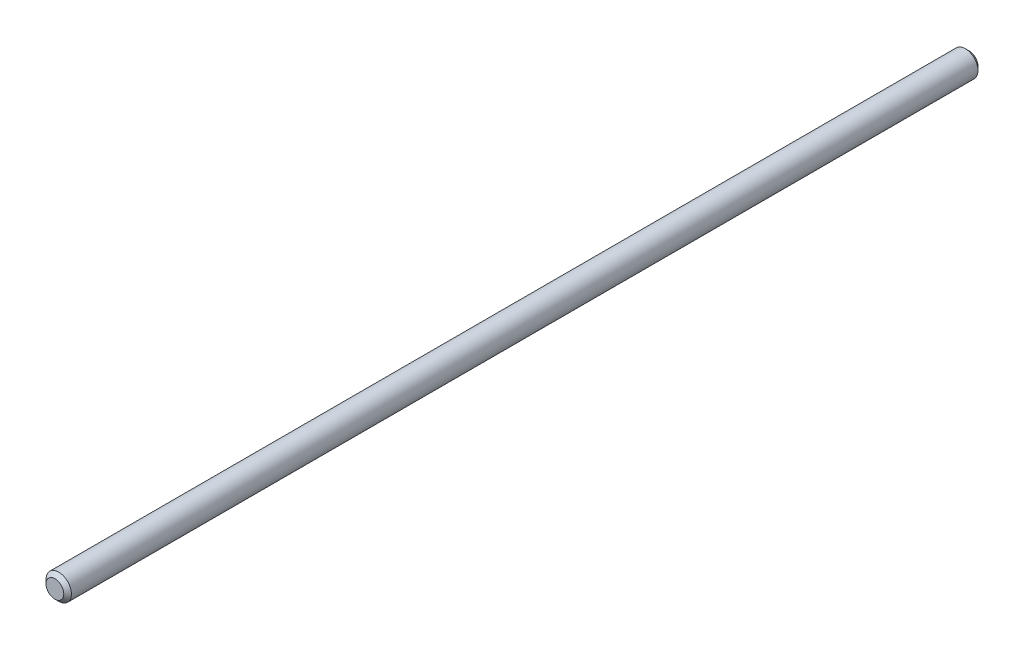
ISO-10303-21;
HEADER;
FILE_DESCRIPTION(('STEP AP214'),'2;1');
FILE_NAME('part.step','',(''),(''),'','','');
FILE_SCHEMA(('AUTOMOTIVE_DESIGN { 1 0 10303 214 1 1 1 1 }'));
ENDSEC;
DATA;
#1=APPLICATION_CONTEXT('core data for automotive mechanical design processes');
#2=APPLICATION_PROTOCOL_DEFINITION('international standard','automotive_design',2000,#1);
#3=PRODUCT_CONTEXT('',#1,'mechanical');
#4=PRODUCT('Part','Part','',(#3));
#5=PRODUCT_RELATED_PRODUCT_CATEGORY('part','',(#4));
#6=PRODUCT_DEFINITION_FORMATION('','',#4);
#7=PRODUCT_DEFINITION_CONTEXT('part definition',#1,'design');
#8=PRODUCT_DEFINITION('design','',#6,#7);
#9=PRODUCT_DEFINITION_SHAPE('','',#8);
#10=(LENGTH_UNIT() NAMED_UNIT(*) SI_UNIT(.MILLI.,.METRE.));
#11=(NAMED_UNIT(*) PLANE_ANGLE_UNIT() SI_UNIT($,.RADIAN.));
#12=(NAMED_UNIT(*) SI_UNIT($,.STERADIAN.) SOLID_ANGLE_UNIT());
#13=UNCERTAINTY_MEASURE_WITH_UNIT(LENGTH_MEASURE(1.E-05),#10,'distance_accuracy_value','');
#14=(GEOMETRIC_REPRESENTATION_CONTEXT(3) GLOBAL_UNCERTAINTY_ASSIGNED_CONTEXT((#13)) GLOBAL_UNIT_ASSIGNED_CONTEXT((#10,
#11,#12)) REPRESENTATION_CONTEXT('',''));
#15=CARTESIAN_POINT('',(0.,0.,0.));
#16=DIRECTION('',(0.,0.,1.));
#17=DIRECTION('',(1.,0.,0.));
#18=AXIS2_PLACEMENT_3D('',#15,#16,#17);
#19=CARTESIAN_POINT('',(0.,0.,180.));
#20=DIRECTION('',(0.,0.,-1.));
#21=DIRECTION('',(-1.,0.,0.));
#22=AXIS2_PLACEMENT_3D('',#19,#20,#21);
#23=CYLINDRICAL_SURFACE('',#22,2.5);
#24=CARTESIAN_POINT('',(0.,0.,0.750000000000112));
#25=DIRECTION('',(0.,0.,1.));
#26=DIRECTION('',(1.,0.,0.));
#27=AXIS2_PLACEMENT_3D('',#24,#25,#26);
#28=CIRCLE('',#27,2.5);
#29=CARTESIAN_POINT('',(-2.5,0.,0.750000000000112));
#30=VERTEX_POINT('',#29);
#31=EDGE_CURVE('E42',#30,#30,#28,.T.);
#32=CARTESIAN_POINT('',(0.,0.,179.25));
#33=DIRECTION('',(0.,0.,1.));
#34=DIRECTION('',(1.,0.,0.));
#35=AXIS2_PLACEMENT_3D('',#32,#33,#34);
#36=CIRCLE('',#35,2.5);
#37=CARTESIAN_POINT('',(-2.5,0.,179.25));
#38=VERTEX_POINT('',#37);
#39=EDGE_CURVE('E46',#38,#38,#36,.F.);
#40=CARTESIAN_POINT('',(-2.5,0.,0.750000000000112));
#41=CARTESIAN_POINT('',(-2.5,0.,2.6093750000001));
#42=CARTESIAN_POINT('',(-2.5,0.,4.4687500000001));
#43=CARTESIAN_POINT('',(-2.5,0.,8.18750000000011));
#44=CARTESIAN_POINT('',(-2.5,0.,10.0468750000001));
#45=CARTESIAN_POINT('',(-2.5,0.,13.7656250000001));
#46=CARTESIAN_POINT('',(-2.5,0.,15.6250000000001));
#47=CARTESIAN_POINT('',(-2.5,0.,19.3437500000001));
#48=CARTESIAN_POINT('',(-2.5,0.,21.2031250000001));
#49=CARTESIAN_POINT('',(-2.5,0.,24.9218750000001));
#50=CARTESIAN_POINT('',(-2.5,0.,26.7812500000001));
#51=CARTESIAN_POINT('',(-2.5,0.,30.5000000000001));
#52=CARTESIAN_POINT('',(-2.5,0.,32.3593750000001));
#53=CARTESIAN_POINT('',(-2.5,0.,36.0781250000001));
#54=CARTESIAN_POINT('',(-2.5,0.,37.9375000000001));
#55=CARTESIAN_POINT('',(-2.5,0.,41.6562500000001));
#56=CARTESIAN_POINT('',(-2.5,0.,43.5156250000001));
#57=CARTESIAN_POINT('',(-2.5,0.,47.2343750000001));
#58=CARTESIAN_POINT('',(-2.5,0.,49.0937500000001));
#59=CARTESIAN_POINT('',(-2.5,0.,52.8125000000001));
#60=CARTESIAN_POINT('',(-2.5,0.,54.6718750000001));
#61=CARTESIAN_POINT('',(-2.5,0.,58.3906250000001));
#62=CARTESIAN_POINT('',(-2.5,0.,60.2500000000001));
#63=CARTESIAN_POINT('',(-2.5,0.,63.9687500000001));
#64=CARTESIAN_POINT('',(-2.5,0.,65.8281250000001));
#65=CARTESIAN_POINT('',(-2.5,0.,69.5468750000001));
#66=CARTESIAN_POINT('',(-2.5,0.,71.4062500000001));
#67=CARTESIAN_POINT('',(-2.5,0.,75.1250000000001));
#68=CARTESIAN_POINT('',(-2.5,0.,76.9843750000001));
#69=CARTESIAN_POINT('',(-2.5,0.,80.7031250000001));
#70=CARTESIAN_POINT('',(-2.5,0.,82.5625000000001));
#71=CARTESIAN_POINT('',(-2.5,0.,86.2812500000001));
#72=CARTESIAN_POINT('',(-2.5,0.,88.1406250000001));
#73=CARTESIAN_POINT('',(-2.5,0.,91.8593750000001));
#74=CARTESIAN_POINT('',(-2.5,0.,93.7187500000001));
#75=CARTESIAN_POINT('',(-2.5,0.,97.4375000000001));
#76=CARTESIAN_POINT('',(-2.5,0.,99.2968750000001));
#77=CARTESIAN_POINT('',(-2.5,0.,103.015625));
#78=CARTESIAN_POINT('',(-2.5,0.,104.875));
#79=CARTESIAN_POINT('',(-2.5,0.,108.59375));
#80=CARTESIAN_POINT('',(-2.5,0.,110.453125));
#81=CARTESIAN_POINT('',(-2.5,0.,114.171875));
#82=CARTESIAN_POINT('',(-2.5,0.,116.03125));
#83=CARTESIAN_POINT('',(-2.5,0.,119.75));
#84=CARTESIAN_POINT('',(-2.5,0.,121.609375));
#85=CARTESIAN_POINT('',(-2.5,0.,125.328125));
#86=CARTESIAN_POINT('',(-2.5,0.,127.1875));
#87=CARTESIAN_POINT('',(-2.5,0.,130.90625));
#88=CARTESIAN_POINT('',(-2.5,0.,132.765625));
#89=CARTESIAN_POINT('',(-2.5,0.,136.484375));
#90=CARTESIAN_POINT('',(-2.5,0.,138.34375));
#91=CARTESIAN_POINT('',(-2.5,0.,142.0625));
#92=CARTESIAN_POINT('',(-2.5,0.,143.921875));
#93=CARTESIAN_POINT('',(-2.5,0.,147.640625));
#94=CARTESIAN_POINT('',(-2.5,0.,149.5));
#95=CARTESIAN_POINT('',(-2.5,0.,153.21875));
#96=CARTESIAN_POINT('',(-2.5,0.,155.078125));
#97=CARTESIAN_POINT('',(-2.5,0.,158.796875));
#98=CARTESIAN_POINT('',(-2.5,0.,160.65625));
#99=CARTESIAN_POINT('',(-2.5,0.,164.375));
#100=CARTESIAN_POINT('',(-2.5,0.,166.234375));
#101=CARTESIAN_POINT('',(-2.5,0.,169.953125));
#102=CARTESIAN_POINT('',(-2.5,0.,171.8125));
#103=CARTESIAN_POINT('',(-2.5,0.,175.53125));
#104=CARTESIAN_POINT('',(-2.5,0.,177.390625));
#105=CARTESIAN_POINT('',(-2.5,0.,179.25));
#106=B_SPLINE_CURVE_WITH_KNOTS('',3,(#40,#41,#42,#43,#44,#45,#46,#47,#48,#49,#50,#51,#52,#53,
#54,#55,#56,#57,#58,#59,#60,#61,#62,#63,#64,#65,#66,#67,#68,#69,#70,#71,#72,#73,#74,#75,#76,#77,
#78,#79,#80,#81,#82,#83,#84,#85,#86,#87,#88,#89,#90,#91,#92,#93,#94,#95,#96,#97,#98,#99,#100,
#101,#102,#103,#104,#105),.UNSPECIFIED.,.F.,.F.,(4,2,2,2,2,2,2,2,2,2,2,2,2,2,2,2,2,2,2,2,2,2,2,
2,2,2,2,2,2,2,2,2,4),(0.,5.57812499999999,11.15625,16.734375,22.3125,27.890625,33.46875,
39.046875,44.625,50.203125,55.78125,61.359375,66.9375,72.515625,78.09375,83.671875,89.25,
94.828125,100.40625,105.984375,111.5625,117.140625,122.71875,128.296875,133.875,139.453125,
145.03125,150.609375,156.1875,161.765625,167.34375,172.921875,178.5),.UNSPECIFIED.);
#107=EDGE_CURVE('BSEAM31',#30,#38,#106,.T.);
#108=ORIENTED_EDGE('',*,*,#31,.T.);
#109=ORIENTED_EDGE('',*,*,#39,.T.);
#110=ORIENTED_EDGE('',*,*,#107,.T.);
#111=ORIENTED_EDGE('',*,*,#107,.F.);
#112=EDGE_LOOP('',(#108,#110,#109,#111));
#113=FACE_BOUND('',#112,.T.);
#114=ADVANCED_FACE('F31',(#113),#23,.T.);
#115=CARTESIAN_POINT('',(0.,0.,180.));
#116=DIRECTION('',(0.,0.,1.));
#117=DIRECTION('',(1.,0.,0.));
#118=AXIS2_PLACEMENT_3D('',#115,#116,#117);
#119=PLANE('',#118);
#120=CARTESIAN_POINT('',(0.,0.,180.));
#121=DIRECTION('',(0.,0.,1.));
#122=DIRECTION('',(1.,0.,0.));
#123=AXIS2_PLACEMENT_3D('',#120,#121,#122);
#124=CIRCLE('',#123,1.75000000000011);
#125=CARTESIAN_POINT('',(1.75000000000011,0.,180.));
#126=VERTEX_POINT('',#125);
#127=EDGE_CURVE('E10',#126,#126,#124,.T.);
#128=ORIENTED_EDGE('',*,*,#127,.T.);
#129=EDGE_LOOP('',(#128));
#130=FACE_BOUND('',#129,.T.);
#131=ADVANCED_FACE('F62',(#130),#119,.T.);
#132=CARTESIAN_POINT('',(0.,0.,0.));
#133=DIRECTION('',(0.,0.,1.));
#134=DIRECTION('',(1.,0.,0.));
#135=AXIS2_PLACEMENT_3D('',#132,#133,#134);
#136=PLANE('',#135);
#137=CARTESIAN_POINT('',(0.,0.,0.));
#138=DIRECTION('',(0.,0.,1.));
#139=DIRECTION('',(1.,0.,0.));
#140=AXIS2_PLACEMENT_3D('',#137,#138,#139);
#141=CIRCLE('',#140,1.74999999999989);
#142=CARTESIAN_POINT('',(1.74999999999989,0.,0.));
#143=VERTEX_POINT('',#142);
#144=EDGE_CURVE('E38',#143,#143,#141,.F.);
#145=ORIENTED_EDGE('',*,*,#144,.T.);
#146=EDGE_LOOP('',(#145));
#147=FACE_BOUND('',#146,.T.);
#148=ADVANCED_FACE('F59',(#147),#136,.F.);
#149=CARTESIAN_POINT('',(0.,0.,0.750000000000112));
#150=DIRECTION('',(0.,0.,1.));
#151=DIRECTION('',(1.,0.,0.));
#152=AXIS2_PLACEMENT_3D('',#149,#150,#151);
#153=CONICAL_SURFACE('',#152,2.5,0.785398163397447);
#154=ORIENTED_EDGE('',*,*,#144,.F.);
#155=EDGE_LOOP('',(#154));
#156=FACE_BOUND('',#155,.T.);
#157=ORIENTED_EDGE('',*,*,#31,.F.);
#158=EDGE_LOOP('',(#157));
#159=FACE_BOUND('',#158,.T.);
#160=ADVANCED_FACE('F55',(#156,#159),#153,.T.);
#161=CARTESIAN_POINT('',(0.,0.,180.));
#162=DIRECTION('',(0.,0.,-1.));
#163=DIRECTION('',(-1.,0.,0.));
#164=AXIS2_PLACEMENT_3D('',#161,#162,#163);
#165=CONICAL_SURFACE('',#164,1.75000000000011,0.785398163397447);
#166=ORIENTED_EDGE('',*,*,#39,.F.);
#167=EDGE_LOOP('',(#166));
#168=FACE_BOUND('',#167,.T.);
#169=ORIENTED_EDGE('',*,*,#127,.F.);
#170=EDGE_LOOP('',(#169));
#171=FACE_BOUND('',#170,.T.);
#172=ADVANCED_FACE('F33',(#168,#171),#165,.T.);
#173=CLOSED_SHELL('',(#114,#131,#148,#160,#172));
#174=MANIFOLD_SOLID_BREP('B2',#173);
#175=ADVANCED_BREP_SHAPE_REPRESENTATION('',(#18,#174),#14);
#176=SHAPE_DEFINITION_REPRESENTATION(#9,#175);
ENDSEC;
END-ISO-10303-21;
